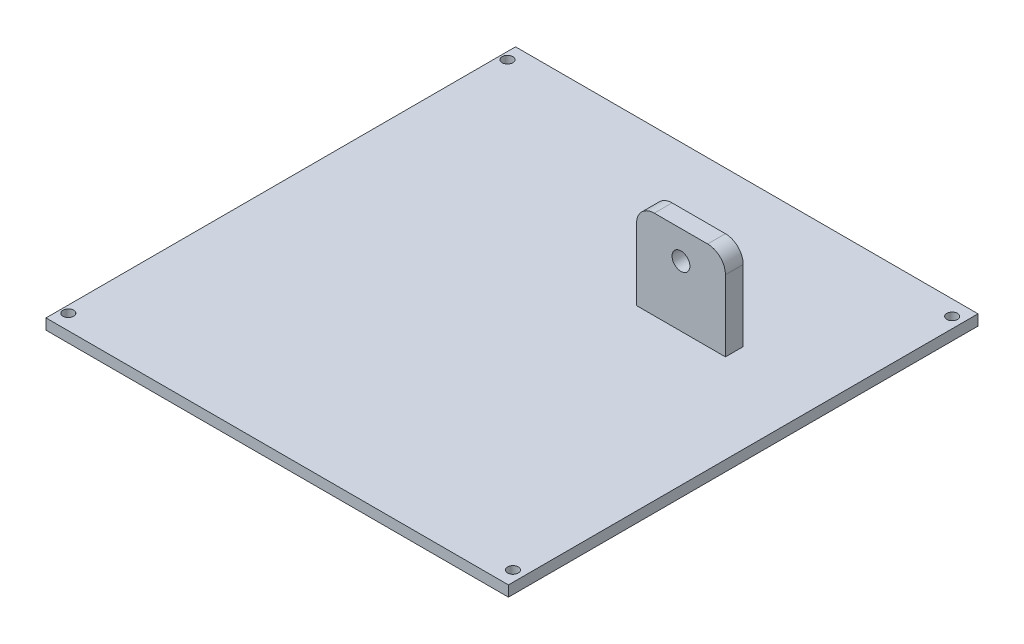
ISO-10303-21;
HEADER;
FILE_DESCRIPTION(('STEP AP214'),'2;1');
FILE_NAME('part.step','',(''),(''),'','','');
FILE_SCHEMA(('AUTOMOTIVE_DESIGN { 1 0 10303 214 1 1 1 1 }'));
ENDSEC;
DATA;
#1=APPLICATION_CONTEXT('core data for automotive mechanical design processes');
#2=APPLICATION_PROTOCOL_DEFINITION('international standard','automotive_design',2000,#1);
#3=PRODUCT_CONTEXT('',#1,'mechanical');
#4=PRODUCT('Part','Part','',(#3));
#5=PRODUCT_RELATED_PRODUCT_CATEGORY('part','',(#4));
#6=PRODUCT_DEFINITION_FORMATION('','',#4);
#7=PRODUCT_DEFINITION_CONTEXT('part definition',#1,'design');
#8=PRODUCT_DEFINITION('design','',#6,#7);
#9=PRODUCT_DEFINITION_SHAPE('','',#8);
#10=(LENGTH_UNIT() NAMED_UNIT(*) SI_UNIT(.MILLI.,.METRE.));
#11=(NAMED_UNIT(*) PLANE_ANGLE_UNIT() SI_UNIT($,.RADIAN.));
#12=(NAMED_UNIT(*) SI_UNIT($,.STERADIAN.) SOLID_ANGLE_UNIT());
#13=UNCERTAINTY_MEASURE_WITH_UNIT(LENGTH_MEASURE(1.E-05),#10,'distance_accuracy_value','');
#14=(GEOMETRIC_REPRESENTATION_CONTEXT(3) GLOBAL_UNCERTAINTY_ASSIGNED_CONTEXT((#13)) GLOBAL_UNIT_ASSIGNED_CONTEXT((#10,
#11,#12)) REPRESENTATION_CONTEXT('',''));
#15=CARTESIAN_POINT('',(0.,0.,0.));
#16=DIRECTION('',(0.,0.,1.));
#17=DIRECTION('',(1.,0.,0.));
#18=AXIS2_PLACEMENT_3D('',#15,#16,#17);
#19=CARTESIAN_POINT('',(0.,3.,0.));
#20=DIRECTION('',(0.,1.,0.));
#21=DIRECTION('',(0.,0.,1.));
#22=AXIS2_PLACEMENT_3D('',#19,#20,#21);
#23=PLANE('',#22);
#24=CARTESIAN_POINT('',(62.,3.,-61.73));
#25=DIRECTION('',(0.,1.,0.));
#26=DIRECTION('',(0.,0.,1.));
#27=AXIS2_PLACEMENT_3D('',#24,#25,#26);
#28=CIRCLE('',#27,1.49999999999999);
#29=CARTESIAN_POINT('',(62.,3.,-60.23));
#30=VERTEX_POINT('',#29);
#31=EDGE_CURVE('E423',#30,#30,#28,.T.);
#32=ORIENTED_EDGE('',*,*,#31,.F.);
#33=EDGE_LOOP('',(#32));
#34=FACE_BOUND('',#33,.T.);
#35=CARTESIAN_POINT('',(-63.,3.,61.73));
#36=DIRECTION('',(0.,1.,0.));
#37=DIRECTION('',(0.,0.,1.));
#38=AXIS2_PLACEMENT_3D('',#35,#36,#37);
#39=CIRCLE('',#38,1.5);
#40=CARTESIAN_POINT('',(-63.,3.,63.23));
#41=VERTEX_POINT('',#40);
#42=EDGE_CURVE('E425',#41,#41,#39,.T.);
#43=ORIENTED_EDGE('',*,*,#42,.F.);
#44=EDGE_LOOP('',(#43));
#45=FACE_BOUND('',#44,.T.);
#46=CARTESIAN_POINT('',(62.,3.,61.73));
#47=DIRECTION('',(0.,1.,0.));
#48=DIRECTION('',(0.,0.,1.));
#49=AXIS2_PLACEMENT_3D('',#46,#47,#48);
#50=CIRCLE('',#49,1.5);
#51=CARTESIAN_POINT('',(62.,3.,63.23));
#52=VERTEX_POINT('',#51);
#53=EDGE_CURVE('E431',#52,#52,#50,.T.);
#54=ORIENTED_EDGE('',*,*,#53,.F.);
#55=EDGE_LOOP('',(#54));
#56=FACE_BOUND('',#55,.T.);
#57=CARTESIAN_POINT('',(-63.,3.,-61.73));
#58=DIRECTION('',(0.,1.,0.));
#59=DIRECTION('',(0.,0.,1.));
#60=AXIS2_PLACEMENT_3D('',#57,#58,#59);
#61=CIRCLE('',#60,1.5);
#62=CARTESIAN_POINT('',(-63.,3.,-60.23));
#63=VERTEX_POINT('',#62);
#64=EDGE_CURVE('E231',#63,#63,#61,.T.);
#65=ORIENTED_EDGE('',*,*,#64,.F.);
#66=EDGE_LOOP('',(#65));
#67=FACE_BOUND('',#66,.T.);
#68=DIRECTION('',(0.,0.,-1.));
#69=VECTOR('',#68,1.);
#70=CARTESIAN_POINT('',(65.,3.,-66.));
#71=LINE('',#70,#69);
#72=CARTESIAN_POINT('',(65.,3.,66.));
#73=VERTEX_POINT('',#72);
#74=CARTESIAN_POINT('',(65.,3.,-66.));
#75=VERTEX_POINT('',#74);
#76=EDGE_CURVE('E161',#73,#75,#71,.T.);
#77=ORIENTED_EDGE('',*,*,#76,.T.);
#78=DIRECTION('',(-1.,0.,0.));
#79=VECTOR('',#78,1.);
#80=CARTESIAN_POINT('',(-65.,3.,-66.));
#81=LINE('',#80,#79);
#82=CARTESIAN_POINT('',(-65.,3.,-66.));
#83=VERTEX_POINT('',#82);
#84=EDGE_CURVE('E165',#75,#83,#81,.T.);
#85=ORIENTED_EDGE('',*,*,#84,.T.);
#86=DIRECTION('',(0.,0.,1.));
#87=VECTOR('',#86,1.);
#88=CARTESIAN_POINT('',(-65.,3.,-66.));
#89=LINE('',#88,#87);
#90=CARTESIAN_POINT('',(-65.,3.,66.));
#91=VERTEX_POINT('',#90);
#92=EDGE_CURVE('E169',#83,#91,#89,.T.);
#93=ORIENTED_EDGE('',*,*,#92,.T.);
#94=DIRECTION('',(1.,0.,0.));
#95=VECTOR('',#94,1.);
#96=CARTESIAN_POINT('',(-65.,3.,66.));
#97=LINE('',#96,#95);
#98=EDGE_CURVE('E172',#91,#73,#97,.T.);
#99=ORIENTED_EDGE('',*,*,#98,.T.);
#100=EDGE_LOOP('',(#77,#85,#93,#99));
#101=FACE_BOUND('',#100,.T.);
#102=DIRECTION('',(1.,0.,0.));
#103=VECTOR('',#102,1.);
#104=CARTESIAN_POINT('',(15.,3.,-20.));
#105=LINE('',#104,#103);
#106=CARTESIAN_POINT('',(15.,3.,-20.));
#107=VERTEX_POINT('',#106);
#108=CARTESIAN_POINT('',(40.,3.,-20.));
#109=VERTEX_POINT('',#108);
#110=EDGE_CURVE('E122',#107,#109,#105,.T.);
#111=ORIENTED_EDGE('',*,*,#110,.F.);
#112=DIRECTION('',(0.,0.,1.));
#113=VECTOR('',#112,1.);
#114=CARTESIAN_POINT('',(15.,3.,-20.));
#115=LINE('',#114,#113);
#116=CARTESIAN_POINT('',(15.,3.,-25.));
#117=VERTEX_POINT('',#116);
#118=EDGE_CURVE('E131',#117,#107,#115,.T.);
#119=ORIENTED_EDGE('',*,*,#118,.F.);
#120=DIRECTION('',(-1.,0.,0.));
#121=VECTOR('',#120,1.);
#122=CARTESIAN_POINT('',(15.,3.,-25.));
#123=LINE('',#122,#121);
#124=CARTESIAN_POINT('',(40.,3.,-25.));
#125=VERTEX_POINT('',#124);
#126=EDGE_CURVE('E146',#125,#117,#123,.T.);
#127=ORIENTED_EDGE('',*,*,#126,.F.);
#128=DIRECTION('',(0.,0.,-1.));
#129=VECTOR('',#128,1.);
#130=CARTESIAN_POINT('',(40.,3.,-20.));
#131=LINE('',#130,#129);
#132=EDGE_CURVE('E142',#109,#125,#131,.T.);
#133=ORIENTED_EDGE('',*,*,#132,.F.);
#134=EDGE_LOOP('',(#111,#119,#127,#133));
#135=FACE_BOUND('',#134,.T.);
#136=ADVANCED_FACE('F40',(#34,#45,#56,#67,#101,#135),#23,.T.);
#137=CARTESIAN_POINT('',(65.,3.,-66.));
#138=DIRECTION('',(-1.,0.,0.));
#139=DIRECTION('',(0.,0.,1.));
#140=AXIS2_PLACEMENT_3D('',#137,#138,#139);
#141=PLANE('',#140);
#142=DIRECTION('',(0.,0.,-1.));
#143=VECTOR('',#142,1.);
#144=CARTESIAN_POINT('',(65.,0.,-66.));
#145=LINE('',#144,#143);
#146=CARTESIAN_POINT('',(65.,0.,66.));
#147=VERTEX_POINT('',#146);
#148=CARTESIAN_POINT('',(65.,0.,-66.));
#149=VERTEX_POINT('',#148);
#150=EDGE_CURVE('E127',#147,#149,#145,.T.);
#151=ORIENTED_EDGE('',*,*,#150,.T.);
#152=DIRECTION('',(0.,-1.,0.));
#153=VECTOR('',#152,1.);
#154=CARTESIAN_POINT('',(65.,3.,-66.));
#155=LINE('',#154,#153);
#156=EDGE_CURVE('E198',#75,#149,#155,.T.);
#157=ORIENTED_EDGE('',*,*,#156,.F.);
#158=ORIENTED_EDGE('',*,*,#76,.F.);
#159=DIRECTION('',(0.,-1.,0.));
#160=VECTOR('',#159,1.);
#161=CARTESIAN_POINT('',(65.,3.,66.));
#162=LINE('',#161,#160);
#163=EDGE_CURVE('E175',#73,#147,#162,.T.);
#164=ORIENTED_EDGE('',*,*,#163,.T.);
#165=EDGE_LOOP('',(#151,#157,#158,#164));
#166=FACE_BOUND('',#165,.T.);
#167=ADVANCED_FACE('F277',(#166),#141,.F.);
#168=CARTESIAN_POINT('',(-65.,3.,-66.));
#169=DIRECTION('',(0.,0.,1.));
#170=DIRECTION('',(1.,0.,0.));
#171=AXIS2_PLACEMENT_3D('',#168,#169,#170);
#172=PLANE('',#171);
#173=DIRECTION('',(-1.,0.,0.));
#174=VECTOR('',#173,1.);
#175=CARTESIAN_POINT('',(-65.,0.,-66.));
#176=LINE('',#175,#174);
#177=CARTESIAN_POINT('',(-65.,0.,-66.));
#178=VERTEX_POINT('',#177);
#179=EDGE_CURVE('E179',#149,#178,#176,.T.);
#180=ORIENTED_EDGE('',*,*,#179,.T.);
#181=DIRECTION('',(0.,-1.,0.));
#182=VECTOR('',#181,1.);
#183=CARTESIAN_POINT('',(-65.,3.,-66.));
#184=LINE('',#183,#182);
#185=EDGE_CURVE('E194',#83,#178,#184,.T.);
#186=ORIENTED_EDGE('',*,*,#185,.F.);
#187=ORIENTED_EDGE('',*,*,#84,.F.);
#188=ORIENTED_EDGE('',*,*,#156,.T.);
#189=EDGE_LOOP('',(#180,#186,#187,#188));
#190=FACE_BOUND('',#189,.T.);
#191=ADVANCED_FACE('F283',(#190),#172,.F.);
#192=CARTESIAN_POINT('',(-65.,3.,-66.));
#193=DIRECTION('',(1.,0.,0.));
#194=DIRECTION('',(0.,0.,-1.));
#195=AXIS2_PLACEMENT_3D('',#192,#193,#194);
#196=PLANE('',#195);
#197=DIRECTION('',(0.,0.,1.));
#198=VECTOR('',#197,1.);
#199=CARTESIAN_POINT('',(-65.,0.,-66.));
#200=LINE('',#199,#198);
#201=CARTESIAN_POINT('',(-65.,0.,66.));
#202=VERTEX_POINT('',#201);
#203=EDGE_CURVE('E182',#178,#202,#200,.T.);
#204=ORIENTED_EDGE('',*,*,#203,.T.);
#205=DIRECTION('',(0.,-1.,0.));
#206=VECTOR('',#205,1.);
#207=CARTESIAN_POINT('',(-65.,3.,66.));
#208=LINE('',#207,#206);
#209=EDGE_CURVE('E190',#91,#202,#208,.T.);
#210=ORIENTED_EDGE('',*,*,#209,.F.);
#211=ORIENTED_EDGE('',*,*,#92,.F.);
#212=ORIENTED_EDGE('',*,*,#185,.T.);
#213=EDGE_LOOP('',(#204,#210,#211,#212));
#214=FACE_BOUND('',#213,.T.);
#215=ADVANCED_FACE('F296',(#214),#196,.F.);
#216=CARTESIAN_POINT('',(-65.,3.,66.));
#217=DIRECTION('',(0.,0.,-1.));
#218=DIRECTION('',(-1.,0.,0.));
#219=AXIS2_PLACEMENT_3D('',#216,#217,#218);
#220=PLANE('',#219);
#221=DIRECTION('',(1.,0.,0.));
#222=VECTOR('',#221,1.);
#223=CARTESIAN_POINT('',(-65.,0.,66.));
#224=LINE('',#223,#222);
#225=EDGE_CURVE('E166',#202,#147,#224,.T.);
#226=ORIENTED_EDGE('',*,*,#225,.T.);
#227=ORIENTED_EDGE('',*,*,#163,.F.);
#228=ORIENTED_EDGE('',*,*,#98,.F.);
#229=ORIENTED_EDGE('',*,*,#209,.T.);
#230=EDGE_LOOP('',(#226,#227,#228,#229));
#231=FACE_BOUND('',#230,.T.);
#232=ADVANCED_FACE('F293',(#231),#220,.F.);
#233=CARTESIAN_POINT('',(0.,0.,0.));
#234=DIRECTION('',(0.,1.,0.));
#235=DIRECTION('',(0.,0.,1.));
#236=AXIS2_PLACEMENT_3D('',#233,#234,#235);
#237=PLANE('',#236);
#238=CARTESIAN_POINT('',(62.,0.,-61.73));
#239=DIRECTION('',(0.,1.,0.));
#240=DIRECTION('',(0.,0.,1.));
#241=AXIS2_PLACEMENT_3D('',#238,#239,#240);
#242=CIRCLE('',#241,1.49999999999999);
#243=CARTESIAN_POINT('',(62.,0.,-60.23));
#244=VERTEX_POINT('',#243);
#245=EDGE_CURVE('E44',#244,#244,#242,.T.);
#246=ORIENTED_EDGE('',*,*,#245,.T.);
#247=EDGE_LOOP('',(#246));
#248=FACE_BOUND('',#247,.T.);
#249=CARTESIAN_POINT('',(-63.,0.,61.73));
#250=DIRECTION('',(0.,1.,0.));
#251=DIRECTION('',(0.,0.,1.));
#252=AXIS2_PLACEMENT_3D('',#249,#250,#251);
#253=CIRCLE('',#252,1.5);
#254=CARTESIAN_POINT('',(-63.,0.,63.23));
#255=VERTEX_POINT('',#254);
#256=EDGE_CURVE('E234',#255,#255,#253,.T.);
#257=ORIENTED_EDGE('',*,*,#256,.T.);
#258=EDGE_LOOP('',(#257));
#259=FACE_BOUND('',#258,.T.);
#260=CARTESIAN_POINT('',(62.,0.,61.73));
#261=DIRECTION('',(0.,1.,0.));
#262=DIRECTION('',(0.,0.,1.));
#263=AXIS2_PLACEMENT_3D('',#260,#261,#262);
#264=CIRCLE('',#263,1.5);
#265=CARTESIAN_POINT('',(62.,0.,63.23));
#266=VERTEX_POINT('',#265);
#267=EDGE_CURVE('E230',#266,#266,#264,.T.);
#268=ORIENTED_EDGE('',*,*,#267,.T.);
#269=EDGE_LOOP('',(#268));
#270=FACE_BOUND('',#269,.T.);
#271=CARTESIAN_POINT('',(-63.,0.,-61.73));
#272=DIRECTION('',(0.,1.,0.));
#273=DIRECTION('',(0.,0.,1.));
#274=AXIS2_PLACEMENT_3D('',#271,#272,#273);
#275=CIRCLE('',#274,1.5);
#276=CARTESIAN_POINT('',(-63.,0.,-60.23));
#277=VERTEX_POINT('',#276);
#278=EDGE_CURVE('E226',#277,#277,#275,.T.);
#279=ORIENTED_EDGE('',*,*,#278,.T.);
#280=EDGE_LOOP('',(#279));
#281=FACE_BOUND('',#280,.T.);
#282=ORIENTED_EDGE('',*,*,#150,.F.);
#283=ORIENTED_EDGE('',*,*,#225,.F.);
#284=ORIENTED_EDGE('',*,*,#203,.F.);
#285=ORIENTED_EDGE('',*,*,#179,.F.);
#286=EDGE_LOOP('',(#282,#283,#284,#285));
#287=FACE_BOUND('',#286,.T.);
#288=ADVANCED_FACE('F290',(#248,#259,#270,#281,#287),#237,.F.);
#289=CARTESIAN_POINT('',(15.,28.,-20.));
#290=DIRECTION('',(1.,0.,0.));
#291=DIRECTION('',(0.,0.,-1.));
#292=AXIS2_PLACEMENT_3D('',#289,#290,#291);
#293=PLANE('',#292);
#294=DIRECTION('',(0.,-1.,0.));
#295=VECTOR('',#294,1.);
#296=CARTESIAN_POINT('',(15.,28.,-20.));
#297=LINE('',#296,#295);
#298=CARTESIAN_POINT('',(15.,23.,-20.));
#299=VERTEX_POINT('',#298);
#300=EDGE_CURVE('E118',#299,#107,#297,.T.);
#301=ORIENTED_EDGE('',*,*,#300,.F.);
#302=DIRECTION('',(0.,0.,1.));
#303=VECTOR('',#302,1.);
#304=CARTESIAN_POINT('',(15.,23.,-20.));
#305=LINE('',#304,#303);
#306=CARTESIAN_POINT('',(15.,23.,-25.));
#307=VERTEX_POINT('',#306);
#308=EDGE_CURVE('E11',#299,#307,#305,.F.);
#309=ORIENTED_EDGE('',*,*,#308,.T.);
#310=DIRECTION('',(0.,-1.,0.));
#311=VECTOR('',#310,1.);
#312=CARTESIAN_POINT('',(15.,28.,-25.));
#313=LINE('',#312,#311);
#314=EDGE_CURVE('E134',#307,#117,#313,.T.);
#315=ORIENTED_EDGE('',*,*,#314,.T.);
#316=ORIENTED_EDGE('',*,*,#118,.T.);
#317=EDGE_LOOP('',(#301,#309,#315,#316));
#318=FACE_BOUND('',#317,.T.);
#319=ADVANCED_FACE('F132',(#318),#293,.F.);
#320=CARTESIAN_POINT('',(15.,28.,-20.));
#321=DIRECTION('',(0.,0.,-1.));
#322=DIRECTION('',(-1.,0.,0.));
#323=AXIS2_PLACEMENT_3D('',#320,#321,#322);
#324=PLANE('',#323);
#325=CARTESIAN_POINT('',(27.5,20.0647295996299,-20.));
#326=DIRECTION('',(0.,0.,1.));
#327=DIRECTION('',(1.,0.,0.));
#328=AXIS2_PLACEMENT_3D('',#325,#326,#327);
#329=CIRCLE('',#328,2.5);
#330=CARTESIAN_POINT('',(30.,20.0647295996299,-20.));
#331=VERTEX_POINT('',#330);
#332=EDGE_CURVE('E225',#331,#331,#329,.T.);
#333=ORIENTED_EDGE('',*,*,#332,.F.);
#334=EDGE_LOOP('',(#333));
#335=FACE_BOUND('',#334,.T.);
#336=DIRECTION('',(0.,-1.,0.));
#337=VECTOR('',#336,1.);
#338=CARTESIAN_POINT('',(40.,28.,-20.));
#339=LINE('',#338,#337);
#340=CARTESIAN_POINT('',(40.,23.,-20.));
#341=VERTEX_POINT('',#340);
#342=EDGE_CURVE('E128',#341,#109,#339,.T.);
#343=ORIENTED_EDGE('',*,*,#342,.F.);
#344=CARTESIAN_POINT('',(35.,23.,-20.));
#345=DIRECTION('',(0.,0.,-1.));
#346=DIRECTION('',(-1.,0.,0.));
#347=AXIS2_PLACEMENT_3D('',#344,#345,#346);
#348=CIRCLE('',#347,5.);
#349=CARTESIAN_POINT('',(35.,28.,-20.));
#350=VERTEX_POINT('',#349);
#351=EDGE_CURVE('E50',#341,#350,#348,.F.);
#352=ORIENTED_EDGE('',*,*,#351,.T.);
#353=DIRECTION('',(1.,0.,0.));
#354=VECTOR('',#353,1.);
#355=CARTESIAN_POINT('',(15.,28.,-20.));
#356=LINE('',#355,#354);
#357=CARTESIAN_POINT('',(20.,28.,-20.));
#358=VERTEX_POINT('',#357);
#359=EDGE_CURVE('E152',#358,#350,#356,.T.);
#360=ORIENTED_EDGE('',*,*,#359,.F.);
#361=CARTESIAN_POINT('',(20.,23.,-20.));
#362=DIRECTION('',(0.,0.,-1.));
#363=DIRECTION('',(-1.,0.,0.));
#364=AXIS2_PLACEMENT_3D('',#361,#362,#363);
#365=CIRCLE('',#364,5.);
#366=EDGE_CURVE('E58',#358,#299,#365,.F.);
#367=ORIENTED_EDGE('',*,*,#366,.T.);
#368=ORIENTED_EDGE('',*,*,#300,.T.);
#369=ORIENTED_EDGE('',*,*,#110,.T.);
#370=EDGE_LOOP('',(#343,#352,#360,#367,#368,#369));
#371=FACE_BOUND('',#370,.T.);
#372=ADVANCED_FACE('F120',(#335,#371),#324,.F.);
#373=CARTESIAN_POINT('',(40.,28.,-20.));
#374=DIRECTION('',(-1.,0.,0.));
#375=DIRECTION('',(0.,0.,1.));
#376=AXIS2_PLACEMENT_3D('',#373,#374,#375);
#377=PLANE('',#376);
#378=DIRECTION('',(0.,-1.,0.));
#379=VECTOR('',#378,1.);
#380=CARTESIAN_POINT('',(40.,28.,-25.));
#381=LINE('',#380,#379);
#382=CARTESIAN_POINT('',(40.,23.,-25.));
#383=VERTEX_POINT('',#382);
#384=EDGE_CURVE('E155',#383,#125,#381,.T.);
#385=ORIENTED_EDGE('',*,*,#384,.F.);
#386=DIRECTION('',(0.,0.,-1.));
#387=VECTOR('',#386,1.);
#388=CARTESIAN_POINT('',(40.,23.,-20.));
#389=LINE('',#388,#387);
#390=EDGE_CURVE('E66',#383,#341,#389,.F.);
#391=ORIENTED_EDGE('',*,*,#390,.T.);
#392=ORIENTED_EDGE('',*,*,#342,.T.);
#393=ORIENTED_EDGE('',*,*,#132,.T.);
#394=EDGE_LOOP('',(#385,#391,#392,#393));
#395=FACE_BOUND('',#394,.T.);
#396=ADVANCED_FACE('F264',(#395),#377,.F.);
#397=CARTESIAN_POINT('',(15.,28.,-25.));
#398=DIRECTION('',(0.,0.,1.));
#399=DIRECTION('',(1.,0.,0.));
#400=AXIS2_PLACEMENT_3D('',#397,#398,#399);
#401=PLANE('',#400);
#402=CARTESIAN_POINT('',(27.5,20.0647295996299,-25.));
#403=DIRECTION('',(0.,0.,1.));
#404=DIRECTION('',(1.,0.,0.));
#405=AXIS2_PLACEMENT_3D('',#402,#403,#404);
#406=CIRCLE('',#405,2.5);
#407=CARTESIAN_POINT('',(30.,20.0647295996299,-25.));
#408=VERTEX_POINT('',#407);
#409=EDGE_CURVE('E139',#408,#408,#406,.T.);
#410=ORIENTED_EDGE('',*,*,#409,.T.);
#411=EDGE_LOOP('',(#410));
#412=FACE_BOUND('',#411,.T.);
#413=DIRECTION('',(-1.,0.,0.));
#414=VECTOR('',#413,1.);
#415=CARTESIAN_POINT('',(15.,28.,-25.));
#416=LINE('',#415,#414);
#417=CARTESIAN_POINT('',(35.,28.,-25.));
#418=VERTEX_POINT('',#417);
#419=CARTESIAN_POINT('',(20.,28.,-25.));
#420=VERTEX_POINT('',#419);
#421=EDGE_CURVE('E156',#418,#420,#416,.T.);
#422=ORIENTED_EDGE('',*,*,#421,.F.);
#423=CARTESIAN_POINT('',(35.,23.,-25.));
#424=DIRECTION('',(0.,0.,1.));
#425=DIRECTION('',(1.,0.,0.));
#426=AXIS2_PLACEMENT_3D('',#423,#424,#425);
#427=CIRCLE('',#426,5.);
#428=EDGE_CURVE('E213',#418,#383,#427,.F.);
#429=ORIENTED_EDGE('',*,*,#428,.T.);
#430=ORIENTED_EDGE('',*,*,#384,.T.);
#431=ORIENTED_EDGE('',*,*,#126,.T.);
#432=ORIENTED_EDGE('',*,*,#314,.F.);
#433=CARTESIAN_POINT('',(20.,23.,-25.));
#434=DIRECTION('',(0.,0.,1.));
#435=DIRECTION('',(1.,0.,0.));
#436=AXIS2_PLACEMENT_3D('',#433,#434,#435);
#437=CIRCLE('',#436,5.);
#438=EDGE_CURVE('E210',#307,#420,#437,.F.);
#439=ORIENTED_EDGE('',*,*,#438,.T.);
#440=EDGE_LOOP('',(#422,#429,#430,#431,#432,#439));
#441=FACE_BOUND('',#440,.T.);
#442=ADVANCED_FACE('F263',(#412,#441),#401,.F.);
#443=CARTESIAN_POINT('',(0.,28.,0.));
#444=DIRECTION('',(0.,-1.,0.));
#445=DIRECTION('',(0.,0.,-1.));
#446=AXIS2_PLACEMENT_3D('',#443,#444,#445);
#447=PLANE('',#446);
#448=ORIENTED_EDGE('',*,*,#359,.T.);
#449=DIRECTION('',(0.,0.,-1.));
#450=VECTOR('',#449,1.);
#451=CARTESIAN_POINT('',(35.,28.,0.));
#452=LINE('',#451,#450);
#453=EDGE_CURVE('E206',#350,#418,#452,.T.);
#454=ORIENTED_EDGE('',*,*,#453,.T.);
#455=ORIENTED_EDGE('',*,*,#421,.T.);
#456=DIRECTION('',(0.,0.,1.));
#457=VECTOR('',#456,1.);
#458=CARTESIAN_POINT('',(20.,28.,0.));
#459=LINE('',#458,#457);
#460=EDGE_CURVE('E202',#420,#358,#459,.T.);
#461=ORIENTED_EDGE('',*,*,#460,.T.);
#462=EDGE_LOOP('',(#448,#454,#455,#461));
#463=FACE_BOUND('',#462,.T.);
#464=ADVANCED_FACE('F258',(#463),#447,.F.);
#465=CARTESIAN_POINT('',(35.,23.,0.));
#466=DIRECTION('',(0.,0.,-1.));
#467=DIRECTION('',(-1.,0.,0.));
#468=AXIS2_PLACEMENT_3D('',#465,#466,#467);
#469=CYLINDRICAL_SURFACE('',#468,5.);
#470=ORIENTED_EDGE('',*,*,#351,.F.);
#471=ORIENTED_EDGE('',*,*,#390,.F.);
#472=ORIENTED_EDGE('',*,*,#428,.F.);
#473=ORIENTED_EDGE('',*,*,#453,.F.);
#474=EDGE_LOOP('',(#470,#471,#472,#473));
#475=FACE_BOUND('',#474,.T.);
#476=ADVANCED_FACE('F267',(#475),#469,.T.);
#477=CARTESIAN_POINT('',(20.,23.,0.));
#478=DIRECTION('',(0.,0.,1.));
#479=DIRECTION('',(1.,0.,0.));
#480=AXIS2_PLACEMENT_3D('',#477,#478,#479);
#481=CYLINDRICAL_SURFACE('',#480,5.);
#482=ORIENTED_EDGE('',*,*,#438,.F.);
#483=ORIENTED_EDGE('',*,*,#308,.F.);
#484=ORIENTED_EDGE('',*,*,#366,.F.);
#485=ORIENTED_EDGE('',*,*,#460,.F.);
#486=EDGE_LOOP('',(#482,#483,#484,#485));
#487=FACE_BOUND('',#486,.T.);
#488=ADVANCED_FACE('F42',(#487),#481,.T.);
#489=CARTESIAN_POINT('',(27.5,20.0647295996299,-45.));
#490=DIRECTION('',(0.,0.,1.));
#491=DIRECTION('',(1.,0.,0.));
#492=AXIS2_PLACEMENT_3D('',#489,#490,#491);
#493=CYLINDRICAL_SURFACE('',#492,2.5);
#494=ORIENTED_EDGE('',*,*,#332,.T.);
#495=EDGE_LOOP('',(#494));
#496=FACE_BOUND('',#495,.T.);
#497=ORIENTED_EDGE('',*,*,#409,.F.);
#498=EDGE_LOOP('',(#497));
#499=FACE_BOUND('',#498,.T.);
#500=ADVANCED_FACE('F273',(#496,#499),#493,.F.);
#501=CARTESIAN_POINT('',(-63.,-22.,-61.73));
#502=DIRECTION('',(0.,1.,0.));
#503=DIRECTION('',(0.,0.,1.));
#504=AXIS2_PLACEMENT_3D('',#501,#502,#503);
#505=CYLINDRICAL_SURFACE('',#504,1.5);
#506=ORIENTED_EDGE('',*,*,#64,.T.);
#507=EDGE_LOOP('',(#506));
#508=FACE_BOUND('',#507,.T.);
#509=ORIENTED_EDGE('',*,*,#278,.F.);
#510=EDGE_LOOP('',(#509));
#511=FACE_BOUND('',#510,.T.);
#512=ADVANCED_FACE('F379',(#508,#511),#505,.F.);
#513=CARTESIAN_POINT('',(62.,-22.,61.73));
#514=DIRECTION('',(0.,1.,0.));
#515=DIRECTION('',(0.,0.,1.));
#516=AXIS2_PLACEMENT_3D('',#513,#514,#515);
#517=CYLINDRICAL_SURFACE('',#516,1.5);
#518=ORIENTED_EDGE('',*,*,#53,.T.);
#519=EDGE_LOOP('',(#518));
#520=FACE_BOUND('',#519,.T.);
#521=ORIENTED_EDGE('',*,*,#267,.F.);
#522=EDGE_LOOP('',(#521));
#523=FACE_BOUND('',#522,.T.);
#524=ADVANCED_FACE('F384',(#520,#523),#517,.F.);
#525=CARTESIAN_POINT('',(-63.,-22.,61.73));
#526=DIRECTION('',(0.,1.,0.));
#527=DIRECTION('',(0.,0.,1.));
#528=AXIS2_PLACEMENT_3D('',#525,#526,#527);
#529=CYLINDRICAL_SURFACE('',#528,1.5);
#530=ORIENTED_EDGE('',*,*,#42,.T.);
#531=EDGE_LOOP('',(#530));
#532=FACE_BOUND('',#531,.T.);
#533=ORIENTED_EDGE('',*,*,#256,.F.);
#534=EDGE_LOOP('',(#533));
#535=FACE_BOUND('',#534,.T.);
#536=ADVANCED_FACE('F392',(#532,#535),#529,.F.);
#537=CARTESIAN_POINT('',(62.,-22.,-61.73));
#538=DIRECTION('',(0.,1.,0.));
#539=DIRECTION('',(0.,0.,1.));
#540=AXIS2_PLACEMENT_3D('',#537,#538,#539);
#541=CYLINDRICAL_SURFACE('',#540,1.49999999999999);
#542=ORIENTED_EDGE('',*,*,#31,.T.);
#543=EDGE_LOOP('',(#542));
#544=FACE_BOUND('',#543,.T.);
#545=ORIENTED_EDGE('',*,*,#245,.F.);
#546=EDGE_LOOP('',(#545));
#547=FACE_BOUND('',#546,.T.);
#548=ADVANCED_FACE('F400',(#544,#547),#541,.F.);
#549=CLOSED_SHELL('',(#136,#167,#191,#215,#232,#288,#319,#372,#396,#442,#464,#476,#488,#500,
#512,#524,#536,#548));
#550=MANIFOLD_SOLID_BREP('B2',#549);
#551=ADVANCED_BREP_SHAPE_REPRESENTATION('',(#18,#550),#14);
#552=SHAPE_DEFINITION_REPRESENTATION(#9,#551);
ENDSEC;
END-ISO-10303-21;
